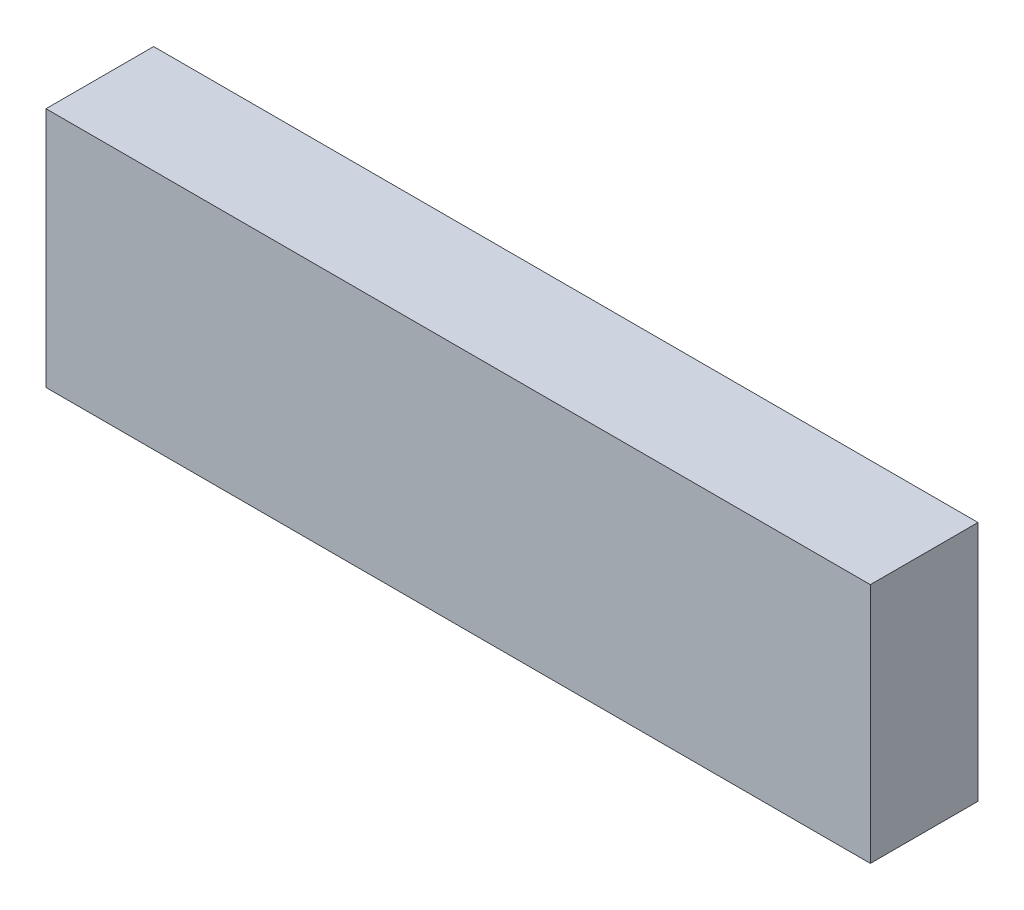
ISO-10303-21;
HEADER;
FILE_DESCRIPTION(('STEP AP214'),'2;1');
FILE_NAME('part.step','',(''),(''),'','','');
FILE_SCHEMA(('AUTOMOTIVE_DESIGN { 1 0 10303 214 1 1 1 1 }'));
ENDSEC;
DATA;
#1=APPLICATION_CONTEXT('core data for automotive mechanical design processes');
#2=APPLICATION_PROTOCOL_DEFINITION('international standard','automotive_design',2000,#1);
#3=PRODUCT_CONTEXT('',#1,'mechanical');
#4=PRODUCT('Part','Part','',(#3));
#5=PRODUCT_RELATED_PRODUCT_CATEGORY('part','',(#4));
#6=PRODUCT_DEFINITION_FORMATION('','',#4);
#7=PRODUCT_DEFINITION_CONTEXT('part definition',#1,'design');
#8=PRODUCT_DEFINITION('design','',#6,#7);
#9=PRODUCT_DEFINITION_SHAPE('','',#8);
#10=(LENGTH_UNIT() NAMED_UNIT(*) SI_UNIT(.MILLI.,.METRE.));
#11=(NAMED_UNIT(*) PLANE_ANGLE_UNIT() SI_UNIT($,.RADIAN.));
#12=(NAMED_UNIT(*) SI_UNIT($,.STERADIAN.) SOLID_ANGLE_UNIT());
#13=UNCERTAINTY_MEASURE_WITH_UNIT(LENGTH_MEASURE(1.E-05),#10,'distance_accuracy_value','');
#14=(GEOMETRIC_REPRESENTATION_CONTEXT(3) GLOBAL_UNCERTAINTY_ASSIGNED_CONTEXT((#13)) GLOBAL_UNIT_ASSIGNED_CONTEXT((#10,
#11,#12)) REPRESENTATION_CONTEXT('',''));
#15=CARTESIAN_POINT('',(0.,0.,0.));
#16=DIRECTION('',(0.,0.,1.));
#17=DIRECTION('',(1.,0.,0.));
#18=AXIS2_PLACEMENT_3D('',#15,#16,#17);
#19=CARTESIAN_POINT('',(-60.5857096201027,19.857240949406,35.));
#20=DIRECTION('',(1.,0.,0.));
#21=DIRECTION('',(0.,1.,0.));
#22=AXIS2_PLACEMENT_3D('',#19,#20,#21);
#23=PLANE('',#22);
#24=DIRECTION('',(0.,-1.,0.));
#25=VECTOR('',#24,1.);
#26=CARTESIAN_POINT('',(-60.5857096201027,19.857240949406,0.));
#27=LINE('',#26,#25);
#28=CARTESIAN_POINT('',(-60.5857096201027,19.857240949406,0.));
#29=VERTEX_POINT('',#28);
#30=CARTESIAN_POINT('',(-60.5857096201027,-58.642759050594,0.));
#31=VERTEX_POINT('',#30);
#32=EDGE_CURVE('E95',#29,#31,#27,.T.);
#33=ORIENTED_EDGE('',*,*,#32,.T.);
#34=DIRECTION('',(0.,0.,-1.));
#35=VECTOR('',#34,1.);
#36=CARTESIAN_POINT('',(-60.5857096201027,-58.642759050594,35.));
#37=LINE('',#36,#35);
#38=CARTESIAN_POINT('',(-60.5857096201027,-58.642759050594,35.));
#39=VERTEX_POINT('',#38);
#40=EDGE_CURVE('E11',#39,#31,#37,.T.);
#41=ORIENTED_EDGE('',*,*,#40,.F.);
#42=DIRECTION('',(0.,-1.,0.));
#43=VECTOR('',#42,1.);
#44=CARTESIAN_POINT('',(-60.5857096201027,19.857240949406,35.));
#45=LINE('',#44,#43);
#46=CARTESIAN_POINT('',(-60.5857096201027,19.857240949406,35.));
#47=VERTEX_POINT('',#46);
#48=EDGE_CURVE('E83',#47,#39,#45,.T.);
#49=ORIENTED_EDGE('',*,*,#48,.F.);
#50=DIRECTION('',(0.,0.,-1.));
#51=VECTOR('',#50,1.);
#52=CARTESIAN_POINT('',(-60.5857096201027,19.857240949406,35.));
#53=LINE('',#52,#51);
#54=EDGE_CURVE('E91',#47,#29,#53,.T.);
#55=ORIENTED_EDGE('',*,*,#54,.T.);
#56=EDGE_LOOP('',(#33,#41,#49,#55));
#57=FACE_BOUND('',#56,.T.);
#58=ADVANCED_FACE('F32',(#57),#23,.F.);
#59=CARTESIAN_POINT('',(-60.5857096201027,-58.642759050594,35.));
#60=DIRECTION('',(0.,1.,0.));
#61=DIRECTION('',(0.,0.,1.));
#62=AXIS2_PLACEMENT_3D('',#59,#60,#61);
#63=PLANE('',#62);
#64=DIRECTION('',(1.,0.,0.));
#65=VECTOR('',#64,1.);
#66=CARTESIAN_POINT('',(-60.5857096201027,-58.642759050594,0.));
#67=LINE('',#66,#65);
#68=CARTESIAN_POINT('',(207.414290379897,-58.642759050594,0.));
#69=VERTEX_POINT('',#68);
#70=EDGE_CURVE('E87',#31,#69,#67,.T.);
#71=ORIENTED_EDGE('',*,*,#70,.T.);
#72=DIRECTION('',(0.,0.,-1.));
#73=VECTOR('',#72,1.);
#74=CARTESIAN_POINT('',(207.414290379897,-58.642759050594,35.));
#75=LINE('',#74,#73);
#76=CARTESIAN_POINT('',(207.414290379897,-58.642759050594,35.));
#77=VERTEX_POINT('',#76);
#78=EDGE_CURVE('E40',#77,#69,#75,.T.);
#79=ORIENTED_EDGE('',*,*,#78,.F.);
#80=DIRECTION('',(1.,0.,0.));
#81=VECTOR('',#80,1.);
#82=CARTESIAN_POINT('',(-60.5857096201027,-58.642759050594,35.));
#83=LINE('',#82,#81);
#84=EDGE_CURVE('E78',#39,#77,#83,.T.);
#85=ORIENTED_EDGE('',*,*,#84,.F.);
#86=ORIENTED_EDGE('',*,*,#40,.T.);
#87=EDGE_LOOP('',(#71,#79,#85,#86));
#88=FACE_BOUND('',#87,.T.);
#89=ADVANCED_FACE('F86',(#88),#63,.F.);
#90=CARTESIAN_POINT('',(207.414290379897,19.857240949406,35.));
#91=DIRECTION('',(-1.,0.,0.));
#92=DIRECTION('',(0.,0.,1.));
#93=AXIS2_PLACEMENT_3D('',#90,#91,#92);
#94=PLANE('',#93);
#95=DIRECTION('',(0.,1.,0.));
#96=VECTOR('',#95,1.);
#97=CARTESIAN_POINT('',(207.414290379897,19.857240949406,0.));
#98=LINE('',#97,#96);
#99=CARTESIAN_POINT('',(207.414290379897,19.857240949406,0.));
#100=VERTEX_POINT('',#99);
#101=EDGE_CURVE('E65',#69,#100,#98,.T.);
#102=ORIENTED_EDGE('',*,*,#101,.T.);
#103=DIRECTION('',(0.,0.,-1.));
#104=VECTOR('',#103,1.);
#105=CARTESIAN_POINT('',(207.414290379897,19.857240949406,35.));
#106=LINE('',#105,#104);
#107=CARTESIAN_POINT('',(207.414290379897,19.857240949406,35.));
#108=VERTEX_POINT('',#107);
#109=EDGE_CURVE('E88',#108,#100,#106,.T.);
#110=ORIENTED_EDGE('',*,*,#109,.F.);
#111=DIRECTION('',(0.,1.,0.));
#112=VECTOR('',#111,1.);
#113=CARTESIAN_POINT('',(207.414290379897,19.857240949406,35.));
#114=LINE('',#113,#112);
#115=EDGE_CURVE('E81',#77,#108,#114,.T.);
#116=ORIENTED_EDGE('',*,*,#115,.F.);
#117=ORIENTED_EDGE('',*,*,#78,.T.);
#118=EDGE_LOOP('',(#102,#110,#116,#117));
#119=FACE_BOUND('',#118,.T.);
#120=ADVANCED_FACE('F89',(#119),#94,.F.);
#121=CARTESIAN_POINT('',(-60.5857096201027,19.857240949406,35.));
#122=DIRECTION('',(0.,-1.,0.));
#123=DIRECTION('',(0.,0.,-1.));
#124=AXIS2_PLACEMENT_3D('',#121,#122,#123);
#125=PLANE('',#124);
#126=DIRECTION('',(-1.,0.,0.));
#127=VECTOR('',#126,1.);
#128=CARTESIAN_POINT('',(-60.5857096201027,19.857240949406,0.));
#129=LINE('',#128,#127);
#130=EDGE_CURVE('E71',#100,#29,#129,.T.);
#131=ORIENTED_EDGE('',*,*,#130,.T.);
#132=ORIENTED_EDGE('',*,*,#54,.F.);
#133=DIRECTION('',(-1.,0.,0.));
#134=VECTOR('',#133,1.);
#135=CARTESIAN_POINT('',(-60.5857096201027,19.857240949406,35.));
#136=LINE('',#135,#134);
#137=EDGE_CURVE('E48',#108,#47,#136,.T.);
#138=ORIENTED_EDGE('',*,*,#137,.F.);
#139=ORIENTED_EDGE('',*,*,#109,.T.);
#140=EDGE_LOOP('',(#131,#132,#138,#139));
#141=FACE_BOUND('',#140,.T.);
#142=ADVANCED_FACE('F102',(#141),#125,.F.);
#143=CARTESIAN_POINT('',(0.,0.,35.));
#144=DIRECTION('',(0.,0.,1.));
#145=DIRECTION('',(1.,0.,0.));
#146=AXIS2_PLACEMENT_3D('',#143,#144,#145);
#147=PLANE('',#146);
#148=ORIENTED_EDGE('',*,*,#48,.T.);
#149=ORIENTED_EDGE('',*,*,#84,.T.);
#150=ORIENTED_EDGE('',*,*,#115,.T.);
#151=ORIENTED_EDGE('',*,*,#137,.T.);
#152=EDGE_LOOP('',(#148,#149,#150,#151));
#153=FACE_BOUND('',#152,.T.);
#154=ADVANCED_FACE('F79',(#153),#147,.T.);
#155=CARTESIAN_POINT('',(0.,0.,0.));
#156=DIRECTION('',(0.,0.,1.));
#157=DIRECTION('',(1.,0.,0.));
#158=AXIS2_PLACEMENT_3D('',#155,#156,#157);
#159=PLANE('',#158);
#160=ORIENTED_EDGE('',*,*,#32,.F.);
#161=ORIENTED_EDGE('',*,*,#130,.F.);
#162=ORIENTED_EDGE('',*,*,#101,.F.);
#163=ORIENTED_EDGE('',*,*,#70,.F.);
#164=EDGE_LOOP('',(#160,#161,#162,#163));
#165=FACE_BOUND('',#164,.T.);
#166=ADVANCED_FACE('F105',(#165),#159,.F.);
#167=CLOSED_SHELL('',(#58,#89,#120,#142,#154,#166));
#168=MANIFOLD_SOLID_BREP('B2',#167);
#169=ADVANCED_BREP_SHAPE_REPRESENTATION('',(#18,#168),#14);
#170=SHAPE_DEFINITION_REPRESENTATION(#9,#169);
ENDSEC;
END-ISO-10303-21;
